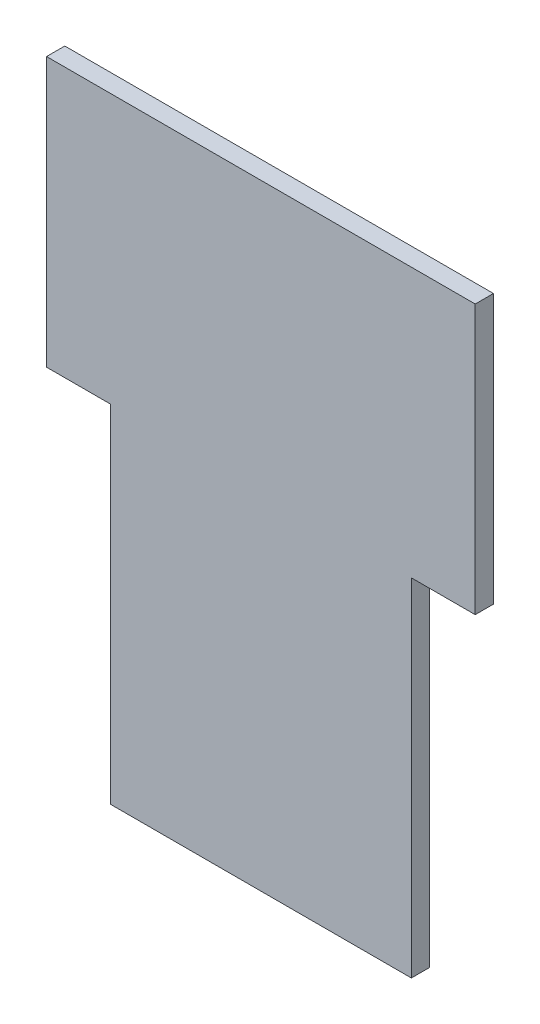
ISO-10303-21;
HEADER;
FILE_DESCRIPTION(('STEP AP214'),'2;1');
FILE_NAME('part.step','',(''),(''),'','','');
FILE_SCHEMA(('AUTOMOTIVE_DESIGN { 1 0 10303 214 1 1 1 1 }'));
ENDSEC;
DATA;
#1=APPLICATION_CONTEXT('core data for automotive mechanical design processes');
#2=APPLICATION_PROTOCOL_DEFINITION('international standard','automotive_design',2000,#1);
#3=PRODUCT_CONTEXT('',#1,'mechanical');
#4=PRODUCT('Part','Part','',(#3));
#5=PRODUCT_RELATED_PRODUCT_CATEGORY('part','',(#4));
#6=PRODUCT_DEFINITION_FORMATION('','',#4);
#7=PRODUCT_DEFINITION_CONTEXT('part definition',#1,'design');
#8=PRODUCT_DEFINITION('design','',#6,#7);
#9=PRODUCT_DEFINITION_SHAPE('','',#8);
#10=(LENGTH_UNIT() NAMED_UNIT(*) SI_UNIT(.MILLI.,.METRE.));
#11=(NAMED_UNIT(*) PLANE_ANGLE_UNIT() SI_UNIT($,.RADIAN.));
#12=(NAMED_UNIT(*) SI_UNIT($,.STERADIAN.) SOLID_ANGLE_UNIT());
#13=UNCERTAINTY_MEASURE_WITH_UNIT(LENGTH_MEASURE(1.E-05),#10,'distance_accuracy_value','');
#14=(GEOMETRIC_REPRESENTATION_CONTEXT(3) GLOBAL_UNCERTAINTY_ASSIGNED_CONTEXT((#13)) GLOBAL_UNIT_ASSIGNED_CONTEXT((#10,
#11,#12)) REPRESENTATION_CONTEXT('',''));
#15=CARTESIAN_POINT('',(0.,0.,0.));
#16=DIRECTION('',(0.,0.,1.));
#17=DIRECTION('',(1.,0.,0.));
#18=AXIS2_PLACEMENT_3D('',#15,#16,#17);
#19=CARTESIAN_POINT('',(235.,310.632183908046,20.));
#20=DIRECTION('',(-1.,0.,0.));
#21=DIRECTION('',(0.,-1.,0.));
#22=AXIS2_PLACEMENT_3D('',#19,#20,#21);
#23=PLANE('',#22);
#24=DIRECTION('',(0.,1.,0.));
#25=VECTOR('',#24,1.);
#26=CARTESIAN_POINT('',(235.,310.632183908046,0.));
#27=LINE('',#26,#25);
#28=CARTESIAN_POINT('',(235.,15.6321839080459,0.));
#29=VERTEX_POINT('',#28);
#30=CARTESIAN_POINT('',(235.,310.632183908046,0.));
#31=VERTEX_POINT('',#30);
#32=EDGE_CURVE('E131',#29,#31,#27,.T.);
#33=ORIENTED_EDGE('',*,*,#32,.T.);
#34=DIRECTION('',(0.,0.,-1.));
#35=VECTOR('',#34,1.);
#36=CARTESIAN_POINT('',(235.,310.632183908046,20.));
#37=LINE('',#36,#35);
#38=CARTESIAN_POINT('',(235.,310.632183908046,20.));
#39=VERTEX_POINT('',#38);
#40=EDGE_CURVE('E11',#39,#31,#37,.T.);
#41=ORIENTED_EDGE('',*,*,#40,.F.);
#42=DIRECTION('',(0.,1.,0.));
#43=VECTOR('',#42,1.);
#44=CARTESIAN_POINT('',(235.,310.632183908046,20.));
#45=LINE('',#44,#43);
#46=CARTESIAN_POINT('',(235.,15.6321839080459,20.));
#47=VERTEX_POINT('',#46);
#48=EDGE_CURVE('E145',#47,#39,#45,.T.);
#49=ORIENTED_EDGE('',*,*,#48,.F.);
#50=DIRECTION('',(0.,0.,-1.));
#51=VECTOR('',#50,1.);
#52=CARTESIAN_POINT('',(235.,15.6321839080459,20.));
#53=LINE('',#52,#51);
#54=EDGE_CURVE('E127',#47,#29,#53,.T.);
#55=ORIENTED_EDGE('',*,*,#54,.T.);
#56=EDGE_LOOP('',(#33,#41,#49,#55));
#57=FACE_BOUND('',#56,.T.);
#58=ADVANCED_FACE('F35',(#57),#23,.F.);
#59=CARTESIAN_POINT('',(-235.,310.632183908046,20.));
#60=DIRECTION('',(0.,-1.,0.));
#61=DIRECTION('',(0.,0.,-1.));
#62=AXIS2_PLACEMENT_3D('',#59,#60,#61);
#63=PLANE('',#62);
#64=DIRECTION('',(-1.,0.,0.));
#65=VECTOR('',#64,1.);
#66=CARTESIAN_POINT('',(-235.,310.632183908046,0.));
#67=LINE('',#66,#65);
#68=CARTESIAN_POINT('',(-235.,310.632183908046,0.));
#69=VERTEX_POINT('',#68);
#70=EDGE_CURVE('E134',#31,#69,#67,.T.);
#71=ORIENTED_EDGE('',*,*,#70,.T.);
#72=DIRECTION('',(0.,0.,-1.));
#73=VECTOR('',#72,1.);
#74=CARTESIAN_POINT('',(-235.,310.632183908046,20.));
#75=LINE('',#74,#73);
#76=CARTESIAN_POINT('',(-235.,310.632183908046,20.));
#77=VERTEX_POINT('',#76);
#78=EDGE_CURVE('E43',#77,#69,#75,.T.);
#79=ORIENTED_EDGE('',*,*,#78,.F.);
#80=DIRECTION('',(-1.,0.,0.));
#81=VECTOR('',#80,1.);
#82=CARTESIAN_POINT('',(-235.,310.632183908046,20.));
#83=LINE('',#82,#81);
#84=EDGE_CURVE('E94',#39,#77,#83,.T.);
#85=ORIENTED_EDGE('',*,*,#84,.F.);
#86=ORIENTED_EDGE('',*,*,#40,.T.);
#87=EDGE_LOOP('',(#71,#79,#85,#86));
#88=FACE_BOUND('',#87,.T.);
#89=ADVANCED_FACE('F180',(#88),#63,.F.);
#90=CARTESIAN_POINT('',(-235.,310.632183908046,20.));
#91=DIRECTION('',(1.,0.,0.));
#92=DIRECTION('',(0.,1.,0.));
#93=AXIS2_PLACEMENT_3D('',#90,#91,#92);
#94=PLANE('',#93);
#95=DIRECTION('',(0.,-1.,0.));
#96=VECTOR('',#95,1.);
#97=CARTESIAN_POINT('',(-235.,310.632183908046,0.));
#98=LINE('',#97,#96);
#99=CARTESIAN_POINT('',(-235.,15.6321839080459,0.));
#100=VERTEX_POINT('',#99);
#101=EDGE_CURVE('E136',#69,#100,#98,.T.);
#102=ORIENTED_EDGE('',*,*,#101,.T.);
#103=DIRECTION('',(0.,0.,-1.));
#104=VECTOR('',#103,1.);
#105=CARTESIAN_POINT('',(-235.,15.6321839080459,20.));
#106=LINE('',#105,#104);
#107=CARTESIAN_POINT('',(-235.,15.6321839080459,20.));
#108=VERTEX_POINT('',#107);
#109=EDGE_CURVE('E152',#108,#100,#106,.T.);
#110=ORIENTED_EDGE('',*,*,#109,.F.);
#111=DIRECTION('',(0.,-1.,0.));
#112=VECTOR('',#111,1.);
#113=CARTESIAN_POINT('',(-235.,310.632183908046,20.));
#114=LINE('',#113,#112);
#115=EDGE_CURVE('E160',#77,#108,#114,.T.);
#116=ORIENTED_EDGE('',*,*,#115,.F.);
#117=ORIENTED_EDGE('',*,*,#78,.T.);
#118=EDGE_LOOP('',(#102,#110,#116,#117));
#119=FACE_BOUND('',#118,.T.);
#120=ADVANCED_FACE('F158',(#119),#94,.F.);
#121=CARTESIAN_POINT('',(-235.,15.6321839080459,20.));
#122=DIRECTION('',(0.,1.,0.));
#123=DIRECTION('',(-1.,0.,0.));
#124=AXIS2_PLACEMENT_3D('',#121,#122,#123);
#125=PLANE('',#124);
#126=DIRECTION('',(1.,0.,0.));
#127=VECTOR('',#126,1.);
#128=CARTESIAN_POINT('',(-235.,15.6321839080459,0.));
#129=LINE('',#128,#127);
#130=CARTESIAN_POINT('',(-165.,15.6321839080459,0.));
#131=VERTEX_POINT('',#130);
#132=EDGE_CURVE('E138',#100,#131,#129,.T.);
#133=ORIENTED_EDGE('',*,*,#132,.T.);
#134=DIRECTION('',(0.,0.,-1.));
#135=VECTOR('',#134,1.);
#136=CARTESIAN_POINT('',(-165.,15.6321839080459,20.));
#137=LINE('',#136,#135);
#138=CARTESIAN_POINT('',(-165.,15.6321839080459,20.));
#139=VERTEX_POINT('',#138);
#140=EDGE_CURVE('E149',#139,#131,#137,.T.);
#141=ORIENTED_EDGE('',*,*,#140,.F.);
#142=DIRECTION('',(1.,0.,0.));
#143=VECTOR('',#142,1.);
#144=CARTESIAN_POINT('',(-235.,15.6321839080459,20.));
#145=LINE('',#144,#143);
#146=EDGE_CURVE('E172',#108,#139,#145,.T.);
#147=ORIENTED_EDGE('',*,*,#146,.F.);
#148=ORIENTED_EDGE('',*,*,#109,.T.);
#149=EDGE_LOOP('',(#133,#141,#147,#148));
#150=FACE_BOUND('',#149,.T.);
#151=ADVANCED_FACE('F168',(#150),#125,.F.);
#152=CARTESIAN_POINT('',(-165.,15.6321839080459,20.));
#153=DIRECTION('',(1.,0.,0.));
#154=DIRECTION('',(0.,1.,0.));
#155=AXIS2_PLACEMENT_3D('',#152,#153,#154);
#156=PLANE('',#155);
#157=DIRECTION('',(0.,-1.,0.));
#158=VECTOR('',#157,1.);
#159=CARTESIAN_POINT('',(-165.,15.6321839080459,0.));
#160=LINE('',#159,#158);
#161=CARTESIAN_POINT('',(-165.,-364.367816091954,0.));
#162=VERTEX_POINT('',#161);
#163=EDGE_CURVE('E140',#131,#162,#160,.T.);
#164=ORIENTED_EDGE('',*,*,#163,.T.);
#165=DIRECTION('',(0.,0.,-1.));
#166=VECTOR('',#165,1.);
#167=CARTESIAN_POINT('',(-165.,-364.367816091954,20.));
#168=LINE('',#167,#166);
#169=CARTESIAN_POINT('',(-165.,-364.367816091954,20.));
#170=VERTEX_POINT('',#169);
#171=EDGE_CURVE('E122',#170,#162,#168,.T.);
#172=ORIENTED_EDGE('',*,*,#171,.F.);
#173=DIRECTION('',(0.,-1.,0.));
#174=VECTOR('',#173,1.);
#175=CARTESIAN_POINT('',(-165.,15.6321839080459,20.));
#176=LINE('',#175,#174);
#177=EDGE_CURVE('E113',#139,#170,#176,.T.);
#178=ORIENTED_EDGE('',*,*,#177,.F.);
#179=ORIENTED_EDGE('',*,*,#140,.T.);
#180=EDGE_LOOP('',(#164,#172,#178,#179));
#181=FACE_BOUND('',#180,.T.);
#182=ADVANCED_FACE('F171',(#181),#156,.F.);
#183=CARTESIAN_POINT('',(-165.,-364.367816091954,20.));
#184=DIRECTION('',(0.,1.,0.));
#185=DIRECTION('',(0.,0.,1.));
#186=AXIS2_PLACEMENT_3D('',#183,#184,#185);
#187=PLANE('',#186);
#188=DIRECTION('',(1.,0.,0.));
#189=VECTOR('',#188,1.);
#190=CARTESIAN_POINT('',(-165.,-364.367816091954,0.));
#191=LINE('',#190,#189);
#192=CARTESIAN_POINT('',(165.,-364.367816091954,0.));
#193=VERTEX_POINT('',#192);
#194=EDGE_CURVE('E121',#162,#193,#191,.T.);
#195=ORIENTED_EDGE('',*,*,#194,.T.);
#196=DIRECTION('',(0.,0.,-1.));
#197=VECTOR('',#196,1.);
#198=CARTESIAN_POINT('',(165.,-364.367816091954,20.));
#199=LINE('',#198,#197);
#200=CARTESIAN_POINT('',(165.,-364.367816091954,20.));
#201=VERTEX_POINT('',#200);
#202=EDGE_CURVE('E118',#201,#193,#199,.T.);
#203=ORIENTED_EDGE('',*,*,#202,.F.);
#204=DIRECTION('',(1.,0.,0.));
#205=VECTOR('',#204,1.);
#206=CARTESIAN_POINT('',(-165.,-364.367816091954,20.));
#207=LINE('',#206,#205);
#208=EDGE_CURVE('E107',#170,#201,#207,.T.);
#209=ORIENTED_EDGE('',*,*,#208,.F.);
#210=ORIENTED_EDGE('',*,*,#171,.T.);
#211=EDGE_LOOP('',(#195,#203,#209,#210));
#212=FACE_BOUND('',#211,.T.);
#213=ADVANCED_FACE('F119',(#212),#187,.F.);
#214=CARTESIAN_POINT('',(165.,15.6321839080459,20.));
#215=DIRECTION('',(-1.,0.,0.));
#216=DIRECTION('',(0.,-1.,0.));
#217=AXIS2_PLACEMENT_3D('',#214,#215,#216);
#218=PLANE('',#217);
#219=DIRECTION('',(0.,1.,0.));
#220=VECTOR('',#219,1.);
#221=CARTESIAN_POINT('',(165.,15.6321839080459,0.));
#222=LINE('',#221,#220);
#223=CARTESIAN_POINT('',(165.,15.6321839080459,0.));
#224=VERTEX_POINT('',#223);
#225=EDGE_CURVE('E80',#193,#224,#222,.T.);
#226=ORIENTED_EDGE('',*,*,#225,.T.);
#227=DIRECTION('',(0.,0.,-1.));
#228=VECTOR('',#227,1.);
#229=CARTESIAN_POINT('',(165.,15.6321839080459,20.));
#230=LINE('',#229,#228);
#231=CARTESIAN_POINT('',(165.,15.6321839080459,20.));
#232=VERTEX_POINT('',#231);
#233=EDGE_CURVE('E123',#232,#224,#230,.T.);
#234=ORIENTED_EDGE('',*,*,#233,.F.);
#235=DIRECTION('',(0.,1.,0.));
#236=VECTOR('',#235,1.);
#237=CARTESIAN_POINT('',(165.,15.6321839080459,20.));
#238=LINE('',#237,#236);
#239=EDGE_CURVE('E111',#201,#232,#238,.T.);
#240=ORIENTED_EDGE('',*,*,#239,.F.);
#241=ORIENTED_EDGE('',*,*,#202,.T.);
#242=EDGE_LOOP('',(#226,#234,#240,#241));
#243=FACE_BOUND('',#242,.T.);
#244=ADVANCED_FACE('F125',(#243),#218,.F.);
#245=CARTESIAN_POINT('',(235.,15.6321839080459,20.));
#246=DIRECTION('',(0.,1.,0.));
#247=DIRECTION('',(-1.,0.,0.));
#248=AXIS2_PLACEMENT_3D('',#245,#246,#247);
#249=PLANE('',#248);
#250=DIRECTION('',(1.,0.,0.));
#251=VECTOR('',#250,1.);
#252=CARTESIAN_POINT('',(235.,15.6321839080459,0.));
#253=LINE('',#252,#251);
#254=EDGE_CURVE('E86',#224,#29,#253,.T.);
#255=ORIENTED_EDGE('',*,*,#254,.T.);
#256=ORIENTED_EDGE('',*,*,#54,.F.);
#257=DIRECTION('',(1.,0.,0.));
#258=VECTOR('',#257,1.);
#259=CARTESIAN_POINT('',(235.,15.6321839080459,20.));
#260=LINE('',#259,#258);
#261=EDGE_CURVE('E51',#232,#47,#260,.T.);
#262=ORIENTED_EDGE('',*,*,#261,.F.);
#263=ORIENTED_EDGE('',*,*,#233,.T.);
#264=EDGE_LOOP('',(#255,#256,#262,#263));
#265=FACE_BOUND('',#264,.T.);
#266=ADVANCED_FACE('F196',(#265),#249,.F.);
#267=CARTESIAN_POINT('',(0.,0.,20.));
#268=DIRECTION('',(0.,0.,-1.));
#269=DIRECTION('',(-1.,0.,0.));
#270=AXIS2_PLACEMENT_3D('',#267,#268,#269);
#271=PLANE('',#270);
#272=ORIENTED_EDGE('',*,*,#48,.T.);
#273=ORIENTED_EDGE('',*,*,#84,.T.);
#274=ORIENTED_EDGE('',*,*,#115,.T.);
#275=ORIENTED_EDGE('',*,*,#146,.T.);
#276=ORIENTED_EDGE('',*,*,#177,.T.);
#277=ORIENTED_EDGE('',*,*,#208,.T.);
#278=ORIENTED_EDGE('',*,*,#239,.T.);
#279=ORIENTED_EDGE('',*,*,#261,.T.);
#280=EDGE_LOOP('',(#272,#273,#274,#275,#276,#277,#278,#279));
#281=FACE_BOUND('',#280,.T.);
#282=ADVANCED_FACE('F109',(#281),#271,.F.);
#283=CARTESIAN_POINT('',(0.,0.,0.));
#284=DIRECTION('',(0.,0.,-1.));
#285=DIRECTION('',(-1.,0.,0.));
#286=AXIS2_PLACEMENT_3D('',#283,#284,#285);
#287=PLANE('',#286);
#288=ORIENTED_EDGE('',*,*,#32,.F.);
#289=ORIENTED_EDGE('',*,*,#254,.F.);
#290=ORIENTED_EDGE('',*,*,#225,.F.);
#291=ORIENTED_EDGE('',*,*,#194,.F.);
#292=ORIENTED_EDGE('',*,*,#163,.F.);
#293=ORIENTED_EDGE('',*,*,#132,.F.);
#294=ORIENTED_EDGE('',*,*,#101,.F.);
#295=ORIENTED_EDGE('',*,*,#70,.F.);
#296=EDGE_LOOP('',(#288,#289,#290,#291,#292,#293,#294,#295));
#297=FACE_BOUND('',#296,.T.);
#298=ADVANCED_FACE('F164',(#297),#287,.T.);
#299=CLOSED_SHELL('',(#58,#89,#120,#151,#182,#213,#244,#266,#282,#298));
#300=MANIFOLD_SOLID_BREP('B2',#299);
#301=ADVANCED_BREP_SHAPE_REPRESENTATION('',(#18,#300),#14);
#302=SHAPE_DEFINITION_REPRESENTATION(#9,#301);
ENDSEC;
END-ISO-10303-21;
